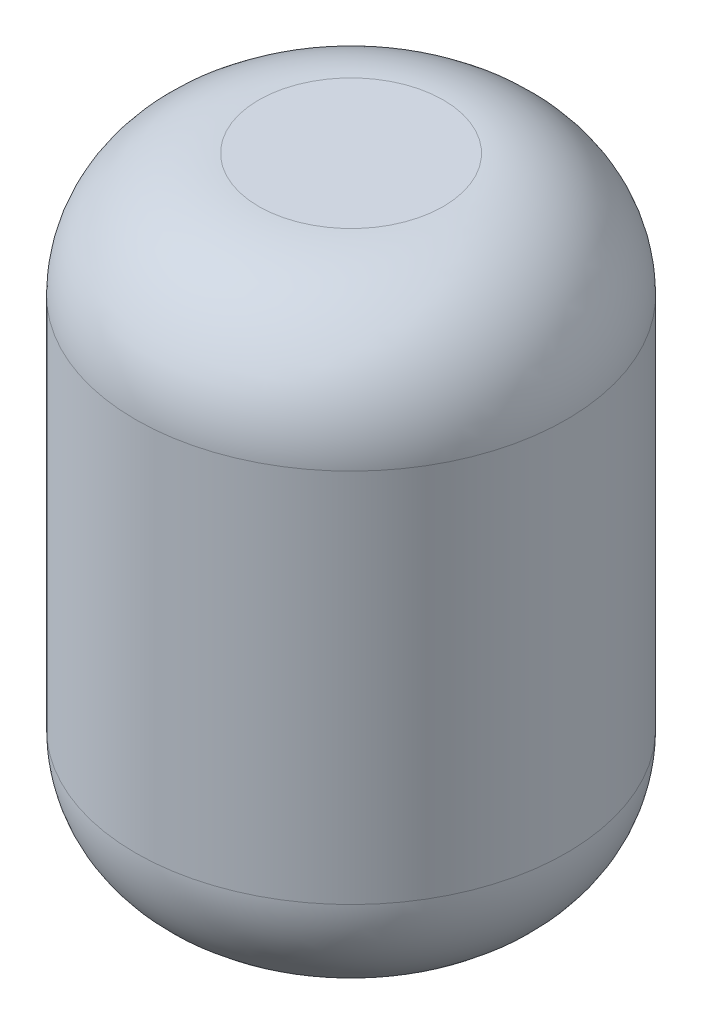
ISO-10303-21;
HEADER;
FILE_DESCRIPTION(('STEP AP214'),'2;1');
FILE_NAME('part.step','',(''),(''),'','','');
FILE_SCHEMA(('AUTOMOTIVE_DESIGN { 1 0 10303 214 1 1 1 1 }'));
ENDSEC;
DATA;
#1=APPLICATION_CONTEXT('core data for automotive mechanical design processes');
#2=APPLICATION_PROTOCOL_DEFINITION('international standard','automotive_design',2000,#1);
#3=PRODUCT_CONTEXT('',#1,'mechanical');
#4=PRODUCT('Part','Part','',(#3));
#5=PRODUCT_RELATED_PRODUCT_CATEGORY('part','',(#4));
#6=PRODUCT_DEFINITION_FORMATION('','',#4);
#7=PRODUCT_DEFINITION_CONTEXT('part definition',#1,'design');
#8=PRODUCT_DEFINITION('design','',#6,#7);
#9=PRODUCT_DEFINITION_SHAPE('','',#8);
#10=(LENGTH_UNIT() NAMED_UNIT(*) SI_UNIT(.MILLI.,.METRE.));
#11=(NAMED_UNIT(*) PLANE_ANGLE_UNIT() SI_UNIT($,.RADIAN.));
#12=(NAMED_UNIT(*) SI_UNIT($,.STERADIAN.) SOLID_ANGLE_UNIT());
#13=UNCERTAINTY_MEASURE_WITH_UNIT(LENGTH_MEASURE(1.E-05),#10,'distance_accuracy_value','');
#14=(GEOMETRIC_REPRESENTATION_CONTEXT(3) GLOBAL_UNCERTAINTY_ASSIGNED_CONTEXT((#13)) GLOBAL_UNIT_ASSIGNED_CONTEXT((#10,
#11,#12)) REPRESENTATION_CONTEXT('',''));
#15=CARTESIAN_POINT('',(0.,0.,0.));
#16=DIRECTION('',(0.,0.,1.));
#17=DIRECTION('',(1.,0.,0.));
#18=AXIS2_PLACEMENT_3D('',#15,#16,#17);
#19=CARTESIAN_POINT('',(0.,202.,0.));
#20=DIRECTION('',(0.,1.,0.));
#21=DIRECTION('',(0.,0.,1.));
#22=AXIS2_PLACEMENT_3D('',#19,#20,#21);
#23=PLANE('',#22);
#24=CARTESIAN_POINT('',(0.,202.,0.));
#25=DIRECTION('',(0.,1.,0.));
#26=DIRECTION('',(0.,0.,1.));
#27=AXIS2_PLACEMENT_3D('',#24,#25,#26);
#28=CIRCLE('',#27,30.);
#29=CARTESIAN_POINT('',(0.,202.,30.));
#30=VERTEX_POINT('',#29);
#31=EDGE_CURVE('E48',#30,#30,#28,.T.);
#32=ORIENTED_EDGE('',*,*,#31,.T.);
#33=EDGE_LOOP('',(#32));
#34=FACE_BOUND('',#33,.T.);
#35=ADVANCED_FACE('F32',(#34),#23,.T.);
#36=CARTESIAN_POINT('',(0.,0.,0.));
#37=DIRECTION('',(0.,1.,0.));
#38=DIRECTION('',(0.,0.,1.));
#39=AXIS2_PLACEMENT_3D('',#36,#37,#38);
#40=PLANE('',#39);
#41=CARTESIAN_POINT('',(0.,0.,0.));
#42=DIRECTION('',(0.,1.,0.));
#43=DIRECTION('',(0.,0.,1.));
#44=AXIS2_PLACEMENT_3D('',#41,#42,#43);
#45=CIRCLE('',#44,30.);
#46=CARTESIAN_POINT('',(0.,0.,30.));
#47=VERTEX_POINT('',#46);
#48=EDGE_CURVE('E10',#47,#47,#45,.F.);
#49=ORIENTED_EDGE('',*,*,#48,.T.);
#50=EDGE_LOOP('',(#49));
#51=FACE_BOUND('',#50,.T.);
#52=ADVANCED_FACE('F93',(#51),#40,.F.);
#53=CARTESIAN_POINT('',(0.,200.,0.));
#54=DIRECTION('',(0.,-1.,0.));
#55=DIRECTION('',(0.,0.,-1.));
#56=AXIS2_PLACEMENT_3D('',#53,#54,#55);
#57=CYLINDRICAL_SURFACE('',#56,70.);
#58=CARTESIAN_POINT('',(0.,162.,0.));
#59=DIRECTION('',(0.,1.,0.));
#60=DIRECTION('',(0.,0.,1.));
#61=AXIS2_PLACEMENT_3D('',#58,#59,#60);
#62=CIRCLE('',#61,70.);
#63=CARTESIAN_POINT('',(0.,162.,70.));
#64=VERTEX_POINT('',#63);
#65=EDGE_CURVE('E40',#64,#64,#62,.F.);
#66=ORIENTED_EDGE('',*,*,#65,.T.);
#67=EDGE_LOOP('',(#66));
#68=FACE_BOUND('',#67,.T.);
#69=CARTESIAN_POINT('',(0.,40.,0.));
#70=DIRECTION('',(0.,1.,0.));
#71=DIRECTION('',(0.,0.,1.));
#72=AXIS2_PLACEMENT_3D('',#69,#70,#71);
#73=CIRCLE('',#72,70.);
#74=CARTESIAN_POINT('',(0.,40.,70.));
#75=VERTEX_POINT('',#74);
#76=EDGE_CURVE('E44',#75,#75,#73,.T.);
#77=ORIENTED_EDGE('',*,*,#76,.T.);
#78=EDGE_LOOP('',(#77));
#79=FACE_BOUND('',#78,.T.);
#80=ADVANCED_FACE('F96',(#68,#79),#57,.T.);
#81=CARTESIAN_POINT('',(0.,162.,0.));
#82=DIRECTION('',(0.,1.,0.));
#83=DIRECTION('',(0.,0.,1.));
#84=AXIS2_PLACEMENT_3D('',#81,#82,#83);
#85=DEGENERATE_TOROIDAL_SURFACE('',#84,30.,40.,.T.);
#86=ORIENTED_EDGE('',*,*,#65,.F.);
#87=EDGE_LOOP('',(#86));
#88=FACE_BOUND('',#87,.T.);
#89=ORIENTED_EDGE('',*,*,#31,.F.);
#90=EDGE_LOOP('',(#89));
#91=FACE_BOUND('',#90,.T.);
#92=ADVANCED_FACE('F98',(#88,#91),#85,.T.);
#93=CARTESIAN_POINT('',(0.,40.,0.));
#94=DIRECTION('',(0.,1.,0.));
#95=DIRECTION('',(0.,0.,1.));
#96=AXIS2_PLACEMENT_3D('',#93,#94,#95);
#97=DEGENERATE_TOROIDAL_SURFACE('',#96,30.,40.,.T.);
#98=ORIENTED_EDGE('',*,*,#48,.F.);
#99=EDGE_LOOP('',(#98));
#100=FACE_BOUND('',#99,.T.);
#101=ORIENTED_EDGE('',*,*,#76,.F.);
#102=EDGE_LOOP('',(#101));
#103=FACE_BOUND('',#102,.T.);
#104=ADVANCED_FACE('F34',(#100,#103),#97,.T.);
#105=CLOSED_SHELL('',(#35,#52,#80,#92,#104));
#106=CARTESIAN_POINT('',(0.,200.,0.));
#107=DIRECTION('',(0.,-1.,0.));
#108=DIRECTION('',(0.,0.,-1.));
#109=AXIS2_PLACEMENT_3D('',#106,#107,#108);
#110=CYLINDRICAL_SURFACE('',#109,68.);
#111=CARTESIAN_POINT('',(0.,42.,0.));
#112=DIRECTION('',(0.,-1.,0.));
#113=DIRECTION('',(0.,0.,-1.));
#114=AXIS2_PLACEMENT_3D('',#111,#112,#113);
#115=CIRCLE('',#114,68.);
#116=CARTESIAN_POINT('',(0.,42.,-68.));
#117=VERTEX_POINT('',#116);
#118=EDGE_CURVE('E59',#117,#117,#115,.T.);
#119=ORIENTED_EDGE('',*,*,#118,.T.);
#120=EDGE_LOOP('',(#119));
#121=FACE_BOUND('',#120,.T.);
#122=CARTESIAN_POINT('',(0.,160.,0.));
#123=DIRECTION('',(0.,1.,0.));
#124=DIRECTION('',(0.,0.,1.));
#125=AXIS2_PLACEMENT_3D('',#122,#123,#124);
#126=CIRCLE('',#125,68.);
#127=CARTESIAN_POINT('',(0.,160.,68.));
#128=VERTEX_POINT('',#127);
#129=EDGE_CURVE('E62',#128,#128,#126,.T.);
#130=ORIENTED_EDGE('',*,*,#129,.T.);
#131=EDGE_LOOP('',(#130));
#132=FACE_BOUND('',#131,.T.);
#133=ADVANCED_FACE('F66',(#121,#132),#110,.F.);
#134=CARTESIAN_POINT('',(0.,2.,0.));
#135=DIRECTION('',(0.,-1.,0.));
#136=DIRECTION('',(0.,0.,-1.));
#137=AXIS2_PLACEMENT_3D('',#134,#135,#136);
#138=PLANE('',#137);
#139=CARTESIAN_POINT('',(0.,2.,0.));
#140=DIRECTION('',(0.,-1.,0.));
#141=DIRECTION('',(0.,0.,-1.));
#142=AXIS2_PLACEMENT_3D('',#139,#140,#141);
#143=CIRCLE('',#142,28.);
#144=CARTESIAN_POINT('',(0.,2.,-28.));
#145=VERTEX_POINT('',#144);
#146=EDGE_CURVE('E56',#145,#145,#143,.F.);
#147=ORIENTED_EDGE('',*,*,#146,.T.);
#148=EDGE_LOOP('',(#147));
#149=FACE_BOUND('',#148,.T.);
#150=ADVANCED_FACE('F82',(#149),#138,.F.);
#151=CARTESIAN_POINT('',(0.,200.,0.));
#152=DIRECTION('',(0.,1.,0.));
#153=DIRECTION('',(0.,0.,1.));
#154=AXIS2_PLACEMENT_3D('',#151,#152,#153);
#155=PLANE('',#154);
#156=CARTESIAN_POINT('',(0.,200.,0.));
#157=DIRECTION('',(0.,1.,0.));
#158=DIRECTION('',(0.,0.,1.));
#159=AXIS2_PLACEMENT_3D('',#156,#157,#158);
#160=CIRCLE('',#159,28.);
#161=CARTESIAN_POINT('',(0.,200.,28.));
#162=VERTEX_POINT('',#161);
#163=EDGE_CURVE('E53',#162,#162,#160,.F.);
#164=ORIENTED_EDGE('',*,*,#163,.T.);
#165=EDGE_LOOP('',(#164));
#166=FACE_BOUND('',#165,.T.);
#167=ADVANCED_FACE('F77',(#166),#155,.F.);
#168=CARTESIAN_POINT('',(0.,42.,0.));
#169=DIRECTION('',(0.,-1.,0.));
#170=DIRECTION('',(0.,0.,-1.));
#171=AXIS2_PLACEMENT_3D('',#168,#169,#170);
#172=DEGENERATE_TOROIDAL_SURFACE('',#171,28.,40.,.T.);
#173=ORIENTED_EDGE('',*,*,#146,.F.);
#174=EDGE_LOOP('',(#173));
#175=FACE_BOUND('',#174,.T.);
#176=ORIENTED_EDGE('',*,*,#118,.F.);
#177=EDGE_LOOP('',(#176));
#178=FACE_BOUND('',#177,.T.);
#179=ADVANCED_FACE('F70',(#175,#178),#172,.F.);
#180=CARTESIAN_POINT('',(0.,160.,0.));
#181=DIRECTION('',(0.,1.,0.));
#182=DIRECTION('',(0.,0.,1.));
#183=AXIS2_PLACEMENT_3D('',#180,#181,#182);
#184=DEGENERATE_TOROIDAL_SURFACE('',#183,28.,40.,.T.);
#185=ORIENTED_EDGE('',*,*,#163,.F.);
#186=EDGE_LOOP('',(#185));
#187=FACE_BOUND('',#186,.T.);
#188=ORIENTED_EDGE('',*,*,#129,.F.);
#189=EDGE_LOOP('',(#188));
#190=FACE_BOUND('',#189,.T.);
#191=ADVANCED_FACE('F68',(#187,#190),#184,.F.);
#192=CLOSED_SHELL('',(#133,#150,#167,#179,#191));
#193=ORIENTED_CLOSED_SHELL('',*,#192,.T.);
#194=BREP_WITH_VOIDS('B2',#105,(#193));
#195=ADVANCED_BREP_SHAPE_REPRESENTATION('',(#18,#194),#14);
#196=SHAPE_DEFINITION_REPRESENTATION(#9,#195);
ENDSEC;
END-ISO-10303-21;
